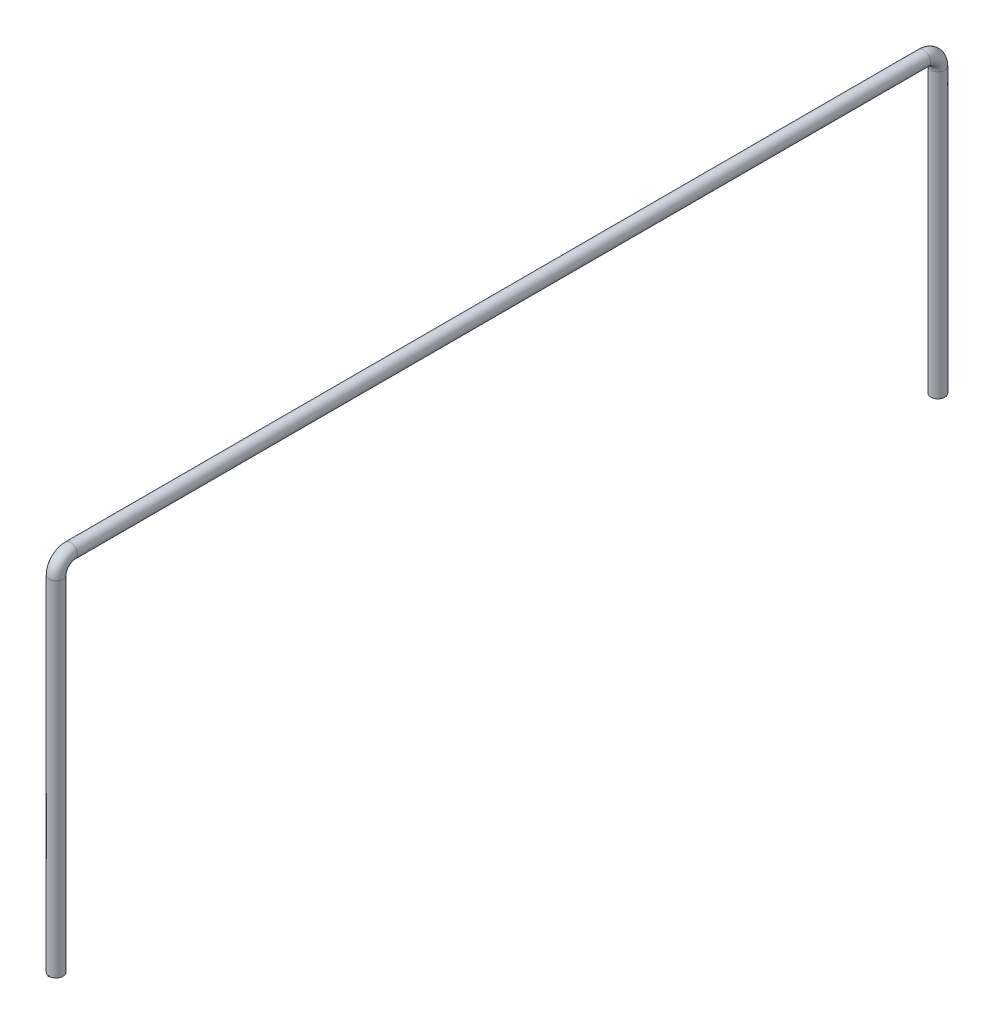
ISO-10303-21;
HEADER;
FILE_DESCRIPTION(('STEP AP214'),'2;1');
FILE_NAME('part.step','',(''),(''),'','','');
FILE_SCHEMA(('AUTOMOTIVE_DESIGN { 1 0 10303 214 1 1 1 1 }'));
ENDSEC;
DATA;
#1=APPLICATION_CONTEXT('core data for automotive mechanical design processes');
#2=APPLICATION_PROTOCOL_DEFINITION('international standard','automotive_design',2000,#1);
#3=PRODUCT_CONTEXT('',#1,'mechanical');
#4=PRODUCT('Part','Part','',(#3));
#5=PRODUCT_RELATED_PRODUCT_CATEGORY('part','',(#4));
#6=PRODUCT_DEFINITION_FORMATION('','',#4);
#7=PRODUCT_DEFINITION_CONTEXT('part definition',#1,'design');
#8=PRODUCT_DEFINITION('design','',#6,#7);
#9=PRODUCT_DEFINITION_SHAPE('','',#8);
#10=(LENGTH_UNIT() NAMED_UNIT(*) SI_UNIT(.MILLI.,.METRE.));
#11=(NAMED_UNIT(*) PLANE_ANGLE_UNIT() SI_UNIT($,.RADIAN.));
#12=(NAMED_UNIT(*) SI_UNIT($,.STERADIAN.) SOLID_ANGLE_UNIT());
#13=UNCERTAINTY_MEASURE_WITH_UNIT(LENGTH_MEASURE(1.E-05),#10,'distance_accuracy_value','');
#14=(GEOMETRIC_REPRESENTATION_CONTEXT(3) GLOBAL_UNCERTAINTY_ASSIGNED_CONTEXT((#13)) GLOBAL_UNIT_ASSIGNED_CONTEXT((#10,
#11,#12)) REPRESENTATION_CONTEXT('',''));
#15=CARTESIAN_POINT('',(0.,0.,0.));
#16=DIRECTION('',(0.,0.,1.));
#17=DIRECTION('',(1.,0.,0.));
#18=AXIS2_PLACEMENT_3D('',#15,#16,#17);
#19=CARTESIAN_POINT('',(0.,400.,0.));
#20=DIRECTION('',(0.,-1.,0.));
#21=DIRECTION('',(0.,0.,-1.));
#22=AXIS2_PLACEMENT_3D('',#19,#20,#21);
#23=CYLINDRICAL_SURFACE('',#22,12.7);
#24=CARTESIAN_POINT('',(0.,1.,0.));
#25=DIRECTION('',(0.,1.,0.));
#26=DIRECTION('',(0.,0.,1.));
#27=AXIS2_PLACEMENT_3D('',#24,#25,#26);
#28=CIRCLE('',#27,12.7);
#29=CARTESIAN_POINT('',(-0.932871203873689,1.,12.6656919004444));
#30=VERTEX_POINT('',#29);
#31=CARTESIAN_POINT('',(0.932871203873689,1.,12.6656919004444));
#32=VERTEX_POINT('',#31);
#33=EDGE_CURVE('E11',#30,#32,#28,.T.);
#34=ORIENTED_EDGE('',*,*,#33,.T.);
#35=DIRECTION('',(0.,-1.,0.));
#36=VECTOR('',#35,1.);
#37=CARTESIAN_POINT('',(0.932871203873689,400.,12.6656919004444));
#38=LINE('',#37,#36);
#39=CARTESIAN_POINT('',(0.932871203873689,0.,12.6656919004444));
#40=VERTEX_POINT('',#39);
#41=EDGE_CURVE('E82',#32,#40,#38,.T.);
#42=ORIENTED_EDGE('',*,*,#41,.T.);
#43=CARTESIAN_POINT('',(0.,0.,0.));
#44=DIRECTION('',(0.,1.,0.));
#45=DIRECTION('',(0.,0.,1.));
#46=AXIS2_PLACEMENT_3D('',#43,#44,#45);
#47=CIRCLE('',#46,12.7);
#48=CARTESIAN_POINT('',(-0.932871203873689,0.,12.6656919004444));
#49=VERTEX_POINT('',#48);
#50=EDGE_CURVE('E43',#40,#49,#47,.T.);
#51=ORIENTED_EDGE('',*,*,#50,.T.);
#52=DIRECTION('',(0.,-1.,0.));
#53=VECTOR('',#52,1.);
#54=CARTESIAN_POINT('',(-0.932871203873689,400.,12.6656919004444));
#55=LINE('',#54,#53);
#56=EDGE_CURVE('E53',#49,#30,#55,.F.);
#57=ORIENTED_EDGE('',*,*,#56,.T.);
#58=EDGE_LOOP('',(#34,#42,#51,#57));
#59=FACE_BOUND('',#58,.T.);
#60=CARTESIAN_POINT('',(0.,624.,0.));
#61=DIRECTION('',(0.,1.,0.));
#62=DIRECTION('',(0.,0.,1.));
#63=AXIS2_PLACEMENT_3D('',#60,#61,#62);
#64=CIRCLE('',#63,12.7);
#65=CARTESIAN_POINT('',(0.,624.,12.7));
#66=VERTEX_POINT('',#65);
#67=EDGE_CURVE('E110',#66,#66,#64,.T.);
#68=ORIENTED_EDGE('',*,*,#67,.F.);
#69=EDGE_LOOP('',(#68));
#70=FACE_BOUND('',#69,.T.);
#71=ADVANCED_FACE('F36',(#59,#70),#23,.T.);
#72=CARTESIAN_POINT('',(0.,0.,0.));
#73=DIRECTION('',(0.,1.,0.));
#74=DIRECTION('',(0.,0.,1.));
#75=AXIS2_PLACEMENT_3D('',#72,#73,#74);
#76=PLANE('',#75);
#77=ORIENTED_EDGE('',*,*,#50,.F.);
#78=DIRECTION('',(0.,0.,1.));
#79=VECTOR('',#78,1.);
#80=CARTESIAN_POINT('',(0.932871203873689,0.,11.9355211837115));
#81=LINE('',#80,#79);
#82=CARTESIAN_POINT('',(0.932871203873689,0.,13.4644788162885));
#83=VERTEX_POINT('',#82);
#84=EDGE_CURVE('E102',#40,#83,#81,.T.);
#85=ORIENTED_EDGE('',*,*,#84,.T.);
#86=DIRECTION('',(-1.,0.,0.));
#87=VECTOR('',#86,1.);
#88=CARTESIAN_POINT('',(-0.932871203873689,0.,13.4644788162885));
#89=LINE('',#88,#87);
#90=CARTESIAN_POINT('',(-0.932871203873689,0.,13.4644788162885));
#91=VERTEX_POINT('',#90);
#92=EDGE_CURVE('E92',#83,#91,#89,.T.);
#93=ORIENTED_EDGE('',*,*,#92,.T.);
#94=DIRECTION('',(0.,0.,-1.));
#95=VECTOR('',#94,1.);
#96=CARTESIAN_POINT('',(-0.932871203873689,0.,11.9355211837115));
#97=LINE('',#96,#95);
#98=EDGE_CURVE('E86',#91,#49,#97,.T.);
#99=ORIENTED_EDGE('',*,*,#98,.T.);
#100=EDGE_LOOP('',(#77,#85,#93,#99));
#101=FACE_BOUND('',#100,.T.);
#102=ADVANCED_FACE('F128',(#101),#76,.F.);
#103=CARTESIAN_POINT('',(0.,110.,-1600.));
#104=DIRECTION('',(0.,-1.,0.));
#105=DIRECTION('',(0.,0.,-1.));
#106=AXIS2_PLACEMENT_3D('',#103,#104,#105);
#107=PLANE('',#106);
#108=CARTESIAN_POINT('',(0.,110.,-1600.));
#109=DIRECTION('',(0.,-1.,0.));
#110=DIRECTION('',(0.,0.,-1.));
#111=AXIS2_PLACEMENT_3D('',#108,#109,#110);
#112=CIRCLE('',#111,12.7);
#113=CARTESIAN_POINT('',(0.,110.,-1612.7));
#114=VERTEX_POINT('',#113);
#115=EDGE_CURVE('E122',#114,#114,#112,.T.);
#116=ORIENTED_EDGE('',*,*,#115,.T.);
#117=EDGE_LOOP('',(#116));
#118=FACE_BOUND('',#117,.T.);
#119=ADVANCED_FACE('F130',(#118),#107,.T.);
#120=CARTESIAN_POINT('',(0.,624.,-26.));
#121=DIRECTION('',(-1.,0.,0.));
#122=DIRECTION('',(0.,0.,1.));
#123=AXIS2_PLACEMENT_3D('',#120,#121,#122);
#124=TOROIDAL_SURFACE('',#123,26.,12.7);
#125=CARTESIAN_POINT('',(0.,650.,-26.));
#126=DIRECTION('',(0.,0.,-1.));
#127=DIRECTION('',(0.,1.,0.));
#128=AXIS2_PLACEMENT_3D('',#125,#126,#127);
#129=CIRCLE('',#128,12.7);
#130=CARTESIAN_POINT('',(0.,662.7,-26.));
#131=VERTEX_POINT('',#130);
#132=EDGE_CURVE('E113',#131,#131,#129,.T.);
#133=CARTESIAN_POINT('',(0.,624.,-26.));
#134=DIRECTION('',(-1.,0.,0.));
#135=DIRECTION('',(0.,0.,1.));
#136=AXIS2_PLACEMENT_3D('',#133,#134,#135);
#137=CIRCLE('',#136,38.7);
#138=EDGE_CURVE('',#66,#131,#137,.T.);
#139=ORIENTED_EDGE('',*,*,#67,.T.);
#140=ORIENTED_EDGE('',*,*,#132,.F.);
#141=ORIENTED_EDGE('',*,*,#138,.T.);
#142=ORIENTED_EDGE('',*,*,#138,.F.);
#143=EDGE_LOOP('',(#139,#141,#140,#142));
#144=FACE_BOUND('',#143,.T.);
#145=ADVANCED_FACE('F136',(#144),#124,.T.);
#146=CARTESIAN_POINT('',(0.,650.,-26.));
#147=DIRECTION('',(0.,0.,-1.));
#148=DIRECTION('',(-1.,0.,0.));
#149=AXIS2_PLACEMENT_3D('',#146,#147,#148);
#150=CYLINDRICAL_SURFACE('',#149,12.7);
#151=CARTESIAN_POINT('',(0.,650.,-1574.));
#152=DIRECTION('',(0.,0.,-1.));
#153=DIRECTION('',(0.,1.,0.));
#154=AXIS2_PLACEMENT_3D('',#151,#152,#153);
#155=CIRCLE('',#154,12.7);
#156=CARTESIAN_POINT('',(0.,662.7,-1574.));
#157=VERTEX_POINT('',#156);
#158=EDGE_CURVE('E116',#157,#157,#155,.T.);
#159=ORIENTED_EDGE('',*,*,#158,.F.);
#160=EDGE_LOOP('',(#159));
#161=FACE_BOUND('',#160,.T.);
#162=ORIENTED_EDGE('',*,*,#132,.T.);
#163=EDGE_LOOP('',(#162));
#164=FACE_BOUND('',#163,.T.);
#165=ADVANCED_FACE('F148',(#161,#164),#150,.T.);
#166=CARTESIAN_POINT('',(0.,624.,-1574.));
#167=DIRECTION('',(-1.,0.,0.));
#168=DIRECTION('',(0.,0.,1.));
#169=AXIS2_PLACEMENT_3D('',#166,#167,#168);
#170=TOROIDAL_SURFACE('',#169,26.,12.7);
#171=CARTESIAN_POINT('',(0.,624.,-1600.));
#172=DIRECTION('',(0.,-1.,0.));
#173=DIRECTION('',(0.,0.,-1.));
#174=AXIS2_PLACEMENT_3D('',#171,#172,#173);
#175=CIRCLE('',#174,12.7);
#176=CARTESIAN_POINT('',(0.,624.,-1612.7));
#177=VERTEX_POINT('',#176);
#178=EDGE_CURVE('E119',#177,#177,#175,.T.);
#179=CARTESIAN_POINT('',(0.,624.,-1574.));
#180=DIRECTION('',(-1.,0.,0.));
#181=DIRECTION('',(0.,0.,1.));
#182=AXIS2_PLACEMENT_3D('',#179,#180,#181);
#183=CIRCLE('',#182,38.7);
#184=EDGE_CURVE('',#157,#177,#183,.T.);
#185=ORIENTED_EDGE('',*,*,#158,.T.);
#186=ORIENTED_EDGE('',*,*,#178,.F.);
#187=ORIENTED_EDGE('',*,*,#184,.T.);
#188=ORIENTED_EDGE('',*,*,#184,.F.);
#189=EDGE_LOOP('',(#185,#187,#186,#188));
#190=FACE_BOUND('',#189,.T.);
#191=ADVANCED_FACE('F140',(#190),#170,.T.);
#192=CARTESIAN_POINT('',(0.,624.,-1600.));
#193=DIRECTION('',(0.,-1.,0.));
#194=DIRECTION('',(0.,0.,-1.));
#195=AXIS2_PLACEMENT_3D('',#192,#193,#194);
#196=CYLINDRICAL_SURFACE('',#195,12.7);
#197=ORIENTED_EDGE('',*,*,#115,.F.);
#198=EDGE_LOOP('',(#197));
#199=FACE_BOUND('',#198,.T.);
#200=ORIENTED_EDGE('',*,*,#178,.T.);
#201=EDGE_LOOP('',(#200));
#202=FACE_BOUND('',#201,.T.);
#203=ADVANCED_FACE('F131',(#199,#202),#196,.T.);
#204=CARTESIAN_POINT('',(0.932871203873689,1.,11.9355211837115));
#205=DIRECTION('',(1.,0.,0.));
#206=DIRECTION('',(0.,0.,-1.));
#207=AXIS2_PLACEMENT_3D('',#204,#205,#206);
#208=PLANE('',#207);
#209=ORIENTED_EDGE('',*,*,#41,.F.);
#210=DIRECTION('',(0.,0.,1.));
#211=VECTOR('',#210,1.);
#212=CARTESIAN_POINT('',(0.932871203873689,1.,11.9355211837115));
#213=LINE('',#212,#211);
#214=CARTESIAN_POINT('',(0.932871203873689,1.,13.4644788162885));
#215=VERTEX_POINT('',#214);
#216=EDGE_CURVE('E76',#32,#215,#213,.T.);
#217=ORIENTED_EDGE('',*,*,#216,.T.);
#218=DIRECTION('',(0.,-1.,0.));
#219=VECTOR('',#218,1.);
#220=CARTESIAN_POINT('',(0.932871203873689,1.,13.4644788162885));
#221=LINE('',#220,#219);
#222=EDGE_CURVE('E80',#215,#83,#221,.T.);
#223=ORIENTED_EDGE('',*,*,#222,.T.);
#224=ORIENTED_EDGE('',*,*,#84,.F.);
#225=EDGE_LOOP('',(#209,#217,#223,#224));
#226=FACE_BOUND('',#225,.T.);
#227=ADVANCED_FACE('F78',(#226),#208,.T.);
#228=CARTESIAN_POINT('',(-0.932871203873689,1.,11.9355211837115));
#229=DIRECTION('',(-1.,0.,0.));
#230=DIRECTION('',(0.,0.,1.));
#231=AXIS2_PLACEMENT_3D('',#228,#229,#230);
#232=PLANE('',#231);
#233=ORIENTED_EDGE('',*,*,#56,.F.);
#234=ORIENTED_EDGE('',*,*,#98,.F.);
#235=DIRECTION('',(0.,-1.,0.));
#236=VECTOR('',#235,1.);
#237=CARTESIAN_POINT('',(-0.932871203873689,1.,13.4644788162885));
#238=LINE('',#237,#236);
#239=CARTESIAN_POINT('',(-0.932871203873689,1.,13.4644788162885));
#240=VERTEX_POINT('',#239);
#241=EDGE_CURVE('E93',#240,#91,#238,.T.);
#242=ORIENTED_EDGE('',*,*,#241,.F.);
#243=DIRECTION('',(0.,0.,-1.));
#244=VECTOR('',#243,1.);
#245=CARTESIAN_POINT('',(-0.932871203873689,1.,11.9355211837115));
#246=LINE('',#245,#244);
#247=EDGE_CURVE('E94',#240,#30,#246,.T.);
#248=ORIENTED_EDGE('',*,*,#247,.T.);
#249=EDGE_LOOP('',(#233,#234,#242,#248));
#250=FACE_BOUND('',#249,.T.);
#251=ADVANCED_FACE('F127',(#250),#232,.T.);
#252=CARTESIAN_POINT('',(-0.932871203873689,1.,13.4644788162885));
#253=DIRECTION('',(0.,0.,1.));
#254=DIRECTION('',(1.,0.,0.));
#255=AXIS2_PLACEMENT_3D('',#252,#253,#254);
#256=PLANE('',#255);
#257=ORIENTED_EDGE('',*,*,#92,.F.);
#258=ORIENTED_EDGE('',*,*,#222,.F.);
#259=DIRECTION('',(-1.,0.,0.));
#260=VECTOR('',#259,1.);
#261=CARTESIAN_POINT('',(-0.932871203873689,1.,13.4644788162885));
#262=LINE('',#261,#260);
#263=EDGE_CURVE('E85',#215,#240,#262,.T.);
#264=ORIENTED_EDGE('',*,*,#263,.T.);
#265=ORIENTED_EDGE('',*,*,#241,.T.);
#266=EDGE_LOOP('',(#257,#258,#264,#265));
#267=FACE_BOUND('',#266,.T.);
#268=ADVANCED_FACE('F90',(#267),#256,.T.);
#269=CARTESIAN_POINT('',(0.,1.,0.));
#270=DIRECTION('',(0.,1.,0.));
#271=DIRECTION('',(0.,0.,1.));
#272=AXIS2_PLACEMENT_3D('',#269,#270,#271);
#273=PLANE('',#272);
#274=ORIENTED_EDGE('',*,*,#33,.F.);
#275=ORIENTED_EDGE('',*,*,#247,.F.);
#276=ORIENTED_EDGE('',*,*,#263,.F.);
#277=ORIENTED_EDGE('',*,*,#216,.F.);
#278=EDGE_LOOP('',(#274,#275,#276,#277));
#279=FACE_BOUND('',#278,.T.);
#280=ADVANCED_FACE('F97',(#279),#273,.T.);
#281=CLOSED_SHELL('',(#71,#102,#119,#145,#165,#191,#203,#227,#251,#268,#280));
#282=MANIFOLD_SOLID_BREP('B2',#281);
#283=ADVANCED_BREP_SHAPE_REPRESENTATION('',(#18,#282),#14);
#284=SHAPE_DEFINITION_REPRESENTATION(#9,#283);
ENDSEC;
END-ISO-10303-21;
